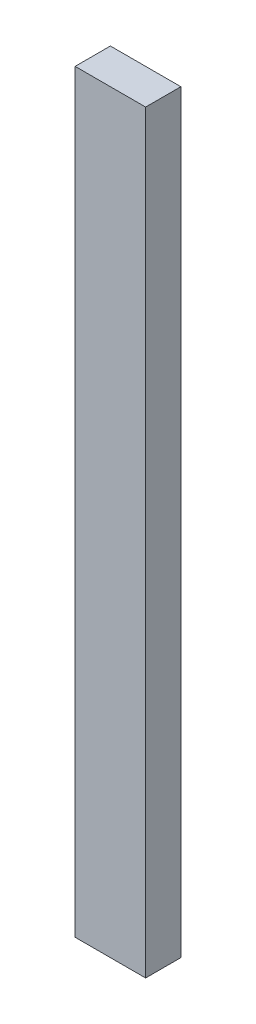
ISO-10303-21;
HEADER;
FILE_DESCRIPTION(('STEP AP214'),'2;1');
FILE_NAME('part.step','',(''),(''),'','','');
FILE_SCHEMA(('AUTOMOTIVE_DESIGN { 1 0 10303 214 1 1 1 1 }'));
ENDSEC;
DATA;
#1=APPLICATION_CONTEXT('core data for automotive mechanical design processes');
#2=APPLICATION_PROTOCOL_DEFINITION('international standard','automotive_design',2000,#1);
#3=PRODUCT_CONTEXT('',#1,'mechanical');
#4=PRODUCT('Part','Part','',(#3));
#5=PRODUCT_RELATED_PRODUCT_CATEGORY('part','',(#4));
#6=PRODUCT_DEFINITION_FORMATION('','',#4);
#7=PRODUCT_DEFINITION_CONTEXT('part definition',#1,'design');
#8=PRODUCT_DEFINITION('design','',#6,#7);
#9=PRODUCT_DEFINITION_SHAPE('','',#8);
#10=(LENGTH_UNIT() NAMED_UNIT(*) SI_UNIT(.MILLI.,.METRE.));
#11=(NAMED_UNIT(*) PLANE_ANGLE_UNIT() SI_UNIT($,.RADIAN.));
#12=(NAMED_UNIT(*) SI_UNIT($,.STERADIAN.) SOLID_ANGLE_UNIT());
#13=UNCERTAINTY_MEASURE_WITH_UNIT(LENGTH_MEASURE(1.E-05),#10,'distance_accuracy_value','');
#14=(GEOMETRIC_REPRESENTATION_CONTEXT(3) GLOBAL_UNCERTAINTY_ASSIGNED_CONTEXT((#13)) GLOBAL_UNIT_ASSIGNED_CONTEXT((#10,
#11,#12)) REPRESENTATION_CONTEXT('',''));
#15=CARTESIAN_POINT('',(0.,0.,0.));
#16=DIRECTION('',(0.,0.,1.));
#17=DIRECTION('',(1.,0.,0.));
#18=AXIS2_PLACEMENT_3D('',#15,#16,#17);
#19=CARTESIAN_POINT('',(-237.333333333333,428.,-74.9999999999999));
#20=DIRECTION('',(1.,0.,0.));
#21=DIRECTION('',(0.,0.,-1.));
#22=AXIS2_PLACEMENT_3D('',#19,#20,#21);
#23=PLANE('',#22);
#24=DIRECTION('',(0.,0.,1.));
#25=VECTOR('',#24,1.);
#26=CARTESIAN_POINT('',(-237.333333333333,0.,-74.9999999999999));
#27=LINE('',#26,#25);
#28=CARTESIAN_POINT('',(-237.333333333333,0.,-74.9999999999999));
#29=VERTEX_POINT('',#28);
#30=CARTESIAN_POINT('',(-237.333333333333,0.,-54.9999999999999));
#31=VERTEX_POINT('',#30);
#32=EDGE_CURVE('E106',#29,#31,#27,.T.);
#33=ORIENTED_EDGE('',*,*,#32,.T.);
#34=DIRECTION('',(0.,-1.,0.));
#35=VECTOR('',#34,1.);
#36=CARTESIAN_POINT('',(-237.333333333333,428.,-54.9999999999999));
#37=LINE('',#36,#35);
#38=CARTESIAN_POINT('',(-237.333333333333,428.,-54.9999999999999));
#39=VERTEX_POINT('',#38);
#40=EDGE_CURVE('E11',#39,#31,#37,.T.);
#41=ORIENTED_EDGE('',*,*,#40,.F.);
#42=DIRECTION('',(0.,0.,1.));
#43=VECTOR('',#42,1.);
#44=CARTESIAN_POINT('',(-237.333333333333,428.,-74.9999999999999));
#45=LINE('',#44,#43);
#46=CARTESIAN_POINT('',(-237.333333333333,428.,-74.9999999999999));
#47=VERTEX_POINT('',#46);
#48=EDGE_CURVE('E94',#47,#39,#45,.T.);
#49=ORIENTED_EDGE('',*,*,#48,.F.);
#50=DIRECTION('',(0.,-1.,0.));
#51=VECTOR('',#50,1.);
#52=CARTESIAN_POINT('',(-237.333333333333,428.,-74.9999999999999));
#53=LINE('',#52,#51);
#54=EDGE_CURVE('E102',#47,#29,#53,.T.);
#55=ORIENTED_EDGE('',*,*,#54,.T.);
#56=EDGE_LOOP('',(#33,#41,#49,#55));
#57=FACE_BOUND('',#56,.T.);
#58=ADVANCED_FACE('F43',(#57),#23,.F.);
#59=CARTESIAN_POINT('',(-237.333333333333,428.,-54.9999999999999));
#60=DIRECTION('',(0.,0.,-1.));
#61=DIRECTION('',(-1.,0.,0.));
#62=AXIS2_PLACEMENT_3D('',#59,#60,#61);
#63=PLANE('',#62);
#64=DIRECTION('',(1.,0.,0.));
#65=VECTOR('',#64,1.);
#66=CARTESIAN_POINT('',(-237.333333333333,0.,-54.9999999999999));
#67=LINE('',#66,#65);
#68=CARTESIAN_POINT('',(-197.333333333333,0.,-54.9999999999999));
#69=VERTEX_POINT('',#68);
#70=EDGE_CURVE('E98',#31,#69,#67,.T.);
#71=ORIENTED_EDGE('',*,*,#70,.T.);
#72=DIRECTION('',(0.,-1.,0.));
#73=VECTOR('',#72,1.);
#74=CARTESIAN_POINT('',(-197.333333333333,428.,-54.9999999999999));
#75=LINE('',#74,#73);
#76=CARTESIAN_POINT('',(-197.333333333333,428.,-54.9999999999999));
#77=VERTEX_POINT('',#76);
#78=EDGE_CURVE('E51',#77,#69,#75,.T.);
#79=ORIENTED_EDGE('',*,*,#78,.F.);
#80=DIRECTION('',(1.,0.,0.));
#81=VECTOR('',#80,1.);
#82=CARTESIAN_POINT('',(-237.333333333333,428.,-54.9999999999999));
#83=LINE('',#82,#81);
#84=EDGE_CURVE('E89',#39,#77,#83,.T.);
#85=ORIENTED_EDGE('',*,*,#84,.F.);
#86=ORIENTED_EDGE('',*,*,#40,.T.);
#87=EDGE_LOOP('',(#71,#79,#85,#86));
#88=FACE_BOUND('',#87,.T.);
#89=ADVANCED_FACE('F97',(#88),#63,.F.);
#90=CARTESIAN_POINT('',(-197.333333333333,428.,-74.9999999999999));
#91=DIRECTION('',(-1.,0.,0.));
#92=DIRECTION('',(0.,0.,1.));
#93=AXIS2_PLACEMENT_3D('',#90,#91,#92);
#94=PLANE('',#93);
#95=DIRECTION('',(0.,0.,-1.));
#96=VECTOR('',#95,1.);
#97=CARTESIAN_POINT('',(-197.333333333333,0.,-74.9999999999999));
#98=LINE('',#97,#96);
#99=CARTESIAN_POINT('',(-197.333333333333,0.,-74.9999999999999));
#100=VERTEX_POINT('',#99);
#101=EDGE_CURVE('E76',#69,#100,#98,.T.);
#102=ORIENTED_EDGE('',*,*,#101,.T.);
#103=DIRECTION('',(0.,-1.,0.));
#104=VECTOR('',#103,1.);
#105=CARTESIAN_POINT('',(-197.333333333333,428.,-74.9999999999999));
#106=LINE('',#105,#104);
#107=CARTESIAN_POINT('',(-197.333333333333,428.,-74.9999999999999));
#108=VERTEX_POINT('',#107);
#109=EDGE_CURVE('E99',#108,#100,#106,.T.);
#110=ORIENTED_EDGE('',*,*,#109,.F.);
#111=DIRECTION('',(0.,0.,-1.));
#112=VECTOR('',#111,1.);
#113=CARTESIAN_POINT('',(-197.333333333333,428.,-74.9999999999999));
#114=LINE('',#113,#112);
#115=EDGE_CURVE('E92',#77,#108,#114,.T.);
#116=ORIENTED_EDGE('',*,*,#115,.F.);
#117=ORIENTED_EDGE('',*,*,#78,.T.);
#118=EDGE_LOOP('',(#102,#110,#116,#117));
#119=FACE_BOUND('',#118,.T.);
#120=ADVANCED_FACE('F100',(#119),#94,.F.);
#121=CARTESIAN_POINT('',(-237.333333333333,428.,-74.9999999999999));
#122=DIRECTION('',(0.,0.,1.));
#123=DIRECTION('',(1.,0.,0.));
#124=AXIS2_PLACEMENT_3D('',#121,#122,#123);
#125=PLANE('',#124);
#126=DIRECTION('',(-1.,0.,0.));
#127=VECTOR('',#126,1.);
#128=CARTESIAN_POINT('',(-237.333333333333,0.,-74.9999999999999));
#129=LINE('',#128,#127);
#130=EDGE_CURVE('E82',#100,#29,#129,.T.);
#131=ORIENTED_EDGE('',*,*,#130,.T.);
#132=ORIENTED_EDGE('',*,*,#54,.F.);
#133=DIRECTION('',(-1.,0.,0.));
#134=VECTOR('',#133,1.);
#135=CARTESIAN_POINT('',(-237.333333333333,428.,-74.9999999999999));
#136=LINE('',#135,#134);
#137=EDGE_CURVE('E59',#108,#47,#136,.T.);
#138=ORIENTED_EDGE('',*,*,#137,.F.);
#139=ORIENTED_EDGE('',*,*,#109,.T.);
#140=EDGE_LOOP('',(#131,#132,#138,#139));
#141=FACE_BOUND('',#140,.T.);
#142=ADVANCED_FACE('F113',(#141),#125,.F.);
#143=CARTESIAN_POINT('',(0.,428.,0.));
#144=DIRECTION('',(0.,1.,0.));
#145=DIRECTION('',(0.,0.,1.));
#146=AXIS2_PLACEMENT_3D('',#143,#144,#145);
#147=PLANE('',#146);
#148=ORIENTED_EDGE('',*,*,#48,.T.);
#149=ORIENTED_EDGE('',*,*,#84,.T.);
#150=ORIENTED_EDGE('',*,*,#115,.T.);
#151=ORIENTED_EDGE('',*,*,#137,.T.);
#152=EDGE_LOOP('',(#148,#149,#150,#151));
#153=FACE_BOUND('',#152,.T.);
#154=ADVANCED_FACE('F90',(#153),#147,.T.);
#155=CARTESIAN_POINT('',(0.,0.,0.));
#156=DIRECTION('',(0.,1.,0.));
#157=DIRECTION('',(0.,0.,1.));
#158=AXIS2_PLACEMENT_3D('',#155,#156,#157);
#159=PLANE('',#158);
#160=ORIENTED_EDGE('',*,*,#32,.F.);
#161=ORIENTED_EDGE('',*,*,#130,.F.);
#162=ORIENTED_EDGE('',*,*,#101,.F.);
#163=ORIENTED_EDGE('',*,*,#70,.F.);
#164=EDGE_LOOP('',(#160,#161,#162,#163));
#165=FACE_BOUND('',#164,.T.);
#166=ADVANCED_FACE('F116',(#165),#159,.F.);
#167=CLOSED_SHELL('',(#58,#89,#120,#142,#154,#166));
#168=MANIFOLD_SOLID_BREP('B2',#167);
#169=ADVANCED_BREP_SHAPE_REPRESENTATION('',(#18,#168),#14);
#170=SHAPE_DEFINITION_REPRESENTATION(#9,#169);
ENDSEC;
END-ISO-10303-21;
